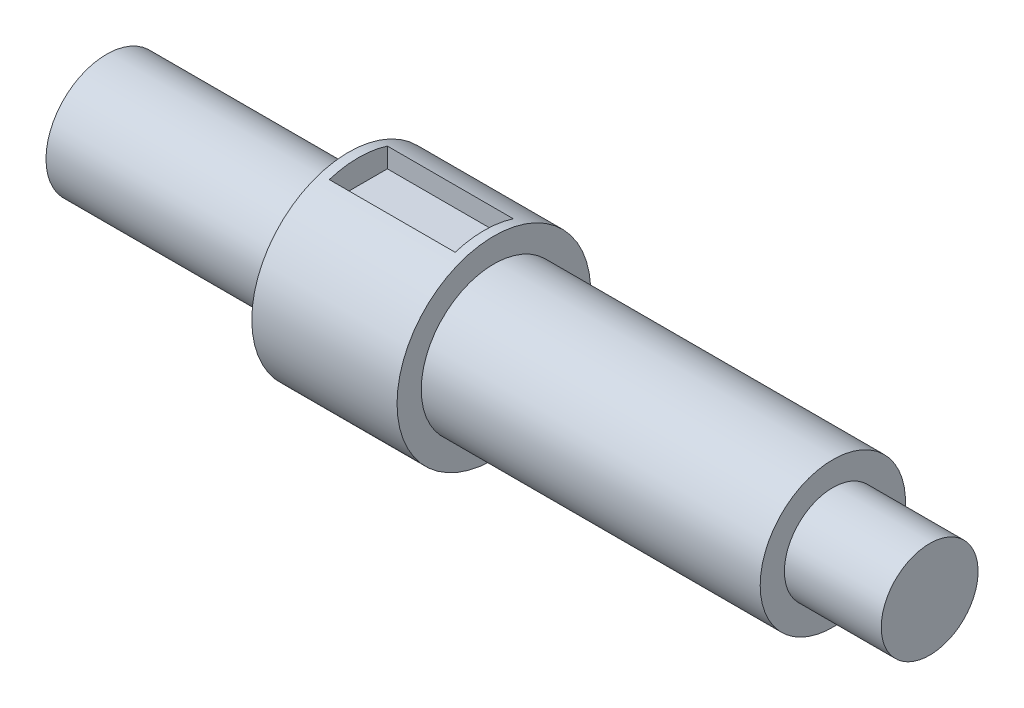
ISO-10303-21;
HEADER;
FILE_DESCRIPTION(('STEP AP214'),'2;1');
FILE_NAME('part.step','',(''),(''),'','','');
FILE_SCHEMA(('AUTOMOTIVE_DESIGN { 1 0 10303 214 1 1 1 1 }'));
ENDSEC;
DATA;
#1=APPLICATION_CONTEXT('core data for automotive mechanical design processes');
#2=APPLICATION_PROTOCOL_DEFINITION('international standard','automotive_design',2000,#1);
#3=PRODUCT_CONTEXT('',#1,'mechanical');
#4=PRODUCT('Part','Part','',(#3));
#5=PRODUCT_RELATED_PRODUCT_CATEGORY('part','',(#4));
#6=PRODUCT_DEFINITION_FORMATION('','',#4);
#7=PRODUCT_DEFINITION_CONTEXT('part definition',#1,'design');
#8=PRODUCT_DEFINITION('design','',#6,#7);
#9=PRODUCT_DEFINITION_SHAPE('','',#8);
#10=(LENGTH_UNIT() NAMED_UNIT(*) SI_UNIT(.MILLI.,.METRE.));
#11=(NAMED_UNIT(*) PLANE_ANGLE_UNIT() SI_UNIT($,.RADIAN.));
#12=(NAMED_UNIT(*) SI_UNIT($,.STERADIAN.) SOLID_ANGLE_UNIT());
#13=UNCERTAINTY_MEASURE_WITH_UNIT(LENGTH_MEASURE(1.E-05),#10,'distance_accuracy_value','');
#14=(GEOMETRIC_REPRESENTATION_CONTEXT(3) GLOBAL_UNCERTAINTY_ASSIGNED_CONTEXT((#13)) GLOBAL_UNIT_ASSIGNED_CONTEXT((#10,
#11,#12)) REPRESENTATION_CONTEXT('',''));
#15=CARTESIAN_POINT('',(0.,0.,0.));
#16=DIRECTION('',(0.,0.,1.));
#17=DIRECTION('',(1.,0.,0.));
#18=AXIS2_PLACEMENT_3D('',#15,#16,#17);
#19=CARTESIAN_POINT('',(0.,12.5,0.));
#20=DIRECTION('',(1.,0.,0.));
#21=DIRECTION('',(0.,0.,-1.));
#22=AXIS2_PLACEMENT_3D('',#19,#20,#21);
#23=PLANE('',#22);
#24=CARTESIAN_POINT('',(0.,0.,0.));
#25=DIRECTION('',(-1.,0.,0.));
#26=DIRECTION('',(0.,0.,1.));
#27=AXIS2_PLACEMENT_3D('',#24,#25,#26);
#28=CIRCLE('',#27,12.5);
#29=CARTESIAN_POINT('',(0.,0.,12.5));
#30=VERTEX_POINT('',#29);
#31=EDGE_CURVE('E109',#30,#30,#28,.T.);
#32=ORIENTED_EDGE('',*,*,#31,.T.);
#33=EDGE_LOOP('',(#32));
#34=FACE_BOUND('',#33,.T.);
#35=ADVANCED_FACE('F41',(#34),#23,.F.);
#36=CARTESIAN_POINT('',(170.,0.,0.));
#37=DIRECTION('',(-1.,0.,0.));
#38=DIRECTION('',(0.,0.,1.));
#39=AXIS2_PLACEMENT_3D('',#36,#37,#38);
#40=PLANE('',#39);
#41=CARTESIAN_POINT('',(170.,0.,0.));
#42=DIRECTION('',(-1.,0.,0.));
#43=DIRECTION('',(0.,0.,1.));
#44=AXIS2_PLACEMENT_3D('',#41,#42,#43);
#45=CIRCLE('',#44,10.);
#46=CARTESIAN_POINT('',(170.,0.,10.));
#47=VERTEX_POINT('',#46);
#48=EDGE_CURVE('E131',#47,#47,#45,.T.);
#49=ORIENTED_EDGE('',*,*,#48,.F.);
#50=EDGE_LOOP('',(#49));
#51=FACE_BOUND('',#50,.T.);
#52=ADVANCED_FACE('F151',(#51),#40,.F.);
#53=CARTESIAN_POINT('',(-10.,0.,0.));
#54=DIRECTION('',(-1.,0.,0.));
#55=DIRECTION('',(0.,0.,1.));
#56=AXIS2_PLACEMENT_3D('',#53,#54,#55);
#57=CYLINDRICAL_SURFACE('',#56,10.);
#58=CARTESIAN_POINT('',(150.,0.,0.));
#59=DIRECTION('',(-1.,0.,0.));
#60=DIRECTION('',(0.,0.,1.));
#61=AXIS2_PLACEMENT_3D('',#58,#59,#60);
#62=CIRCLE('',#61,10.);
#63=CARTESIAN_POINT('',(150.,0.,10.));
#64=VERTEX_POINT('',#63);
#65=EDGE_CURVE('E128',#64,#64,#62,.T.);
#66=ORIENTED_EDGE('',*,*,#65,.F.);
#67=EDGE_LOOP('',(#66));
#68=FACE_BOUND('',#67,.T.);
#69=ORIENTED_EDGE('',*,*,#48,.T.);
#70=EDGE_LOOP('',(#69));
#71=FACE_BOUND('',#70,.T.);
#72=ADVANCED_FACE('F156',(#68,#71),#57,.T.);
#73=CARTESIAN_POINT('',(150.,10.,0.));
#74=DIRECTION('',(-1.,0.,0.));
#75=DIRECTION('',(0.,0.,1.));
#76=AXIS2_PLACEMENT_3D('',#73,#74,#75);
#77=PLANE('',#76);
#78=CARTESIAN_POINT('',(150.,0.,0.));
#79=DIRECTION('',(-1.,0.,0.));
#80=DIRECTION('',(0.,0.,1.));
#81=AXIS2_PLACEMENT_3D('',#78,#79,#80);
#82=CIRCLE('',#81,15.);
#83=CARTESIAN_POINT('',(150.,0.,15.));
#84=VERTEX_POINT('',#83);
#85=EDGE_CURVE('E125',#84,#84,#82,.T.);
#86=ORIENTED_EDGE('',*,*,#85,.F.);
#87=EDGE_LOOP('',(#86));
#88=FACE_BOUND('',#87,.T.);
#89=ORIENTED_EDGE('',*,*,#65,.T.);
#90=EDGE_LOOP('',(#89));
#91=FACE_BOUND('',#90,.T.);
#92=ADVANCED_FACE('F185',(#88,#91),#77,.F.);
#93=CARTESIAN_POINT('',(-10.,0.,0.));
#94=DIRECTION('',(-1.,0.,0.));
#95=DIRECTION('',(0.,0.,1.));
#96=AXIS2_PLACEMENT_3D('',#93,#94,#95);
#97=CYLINDRICAL_SURFACE('',#96,15.);
#98=CARTESIAN_POINT('',(80.,0.,0.));
#99=DIRECTION('',(-1.,0.,0.));
#100=DIRECTION('',(0.,0.,1.));
#101=AXIS2_PLACEMENT_3D('',#98,#99,#100);
#102=CIRCLE('',#101,15.);
#103=CARTESIAN_POINT('',(80.,0.,15.));
#104=VERTEX_POINT('',#103);
#105=EDGE_CURVE('E122',#104,#104,#102,.T.);
#106=ORIENTED_EDGE('',*,*,#105,.F.);
#107=EDGE_LOOP('',(#106));
#108=FACE_BOUND('',#107,.T.);
#109=ORIENTED_EDGE('',*,*,#85,.T.);
#110=EDGE_LOOP('',(#109));
#111=FACE_BOUND('',#110,.T.);
#112=ADVANCED_FACE('F179',(#108,#111),#97,.T.);
#113=CARTESIAN_POINT('',(80.,15.,0.));
#114=DIRECTION('',(-1.,0.,0.));
#115=DIRECTION('',(0.,0.,1.));
#116=AXIS2_PLACEMENT_3D('',#113,#114,#115);
#117=PLANE('',#116);
#118=CARTESIAN_POINT('',(80.,0.,0.));
#119=DIRECTION('',(-1.,0.,0.));
#120=DIRECTION('',(0.,0.,1.));
#121=AXIS2_PLACEMENT_3D('',#118,#119,#120);
#122=CIRCLE('',#121,20.);
#123=CARTESIAN_POINT('',(80.,0.,20.));
#124=VERTEX_POINT('',#123);
#125=EDGE_CURVE('E119',#124,#124,#122,.T.);
#126=ORIENTED_EDGE('',*,*,#125,.F.);
#127=EDGE_LOOP('',(#126));
#128=FACE_BOUND('',#127,.T.);
#129=ORIENTED_EDGE('',*,*,#105,.T.);
#130=EDGE_LOOP('',(#129));
#131=FACE_BOUND('',#130,.T.);
#132=ADVANCED_FACE('F173',(#128,#131),#117,.F.);
#133=CARTESIAN_POINT('',(-10.,0.,0.));
#134=DIRECTION('',(-1.,0.,0.));
#135=DIRECTION('',(0.,0.,1.));
#136=AXIS2_PLACEMENT_3D('',#133,#134,#135);
#137=CYLINDRICAL_SURFACE('',#136,20.);
#138=CARTESIAN_POINT('',(52.,0.,0.));
#139=DIRECTION('',(-1.,0.,0.));
#140=DIRECTION('',(0.,0.,1.));
#141=AXIS2_PLACEMENT_3D('',#138,#139,#140);
#142=CIRCLE('',#141,20.);
#143=CARTESIAN_POINT('',(52.,19.0787840283389,6.));
#144=VERTEX_POINT('',#143);
#145=CARTESIAN_POINT('',(52.,19.0787840283389,-6.));
#146=VERTEX_POINT('',#145);
#147=EDGE_CURVE('E48',#144,#146,#142,.T.);
#148=ORIENTED_EDGE('',*,*,#147,.T.);
#149=DIRECTION('',(-1.,0.,0.));
#150=VECTOR('',#149,1.);
#151=CARTESIAN_POINT('',(-10.,19.0787840283389,-6.));
#152=LINE('',#151,#150);
#153=CARTESIAN_POINT('',(78.,19.0787840283389,-6.));
#154=VERTEX_POINT('',#153);
#155=EDGE_CURVE('E11',#146,#154,#152,.F.);
#156=ORIENTED_EDGE('',*,*,#155,.T.);
#157=CARTESIAN_POINT('',(78.,0.,0.));
#158=DIRECTION('',(1.,0.,0.));
#159=DIRECTION('',(0.,0.,-1.));
#160=AXIS2_PLACEMENT_3D('',#157,#158,#159);
#161=CIRCLE('',#160,20.);
#162=CARTESIAN_POINT('',(78.,19.0787840283389,6.));
#163=VERTEX_POINT('',#162);
#164=EDGE_CURVE('E63',#154,#163,#161,.T.);
#165=ORIENTED_EDGE('',*,*,#164,.T.);
#166=DIRECTION('',(-1.,0.,0.));
#167=VECTOR('',#166,1.);
#168=CARTESIAN_POINT('',(-10.,19.0787840283389,6.));
#169=LINE('',#168,#167);
#170=EDGE_CURVE('E134',#144,#163,#169,.F.);
#171=ORIENTED_EDGE('',*,*,#170,.F.);
#172=EDGE_LOOP('',(#148,#156,#165,#171));
#173=FACE_BOUND('',#172,.T.);
#174=CARTESIAN_POINT('',(50.,0.,0.));
#175=DIRECTION('',(-1.,0.,0.));
#176=DIRECTION('',(0.,0.,1.));
#177=AXIS2_PLACEMENT_3D('',#174,#175,#176);
#178=CIRCLE('',#177,20.);
#179=CARTESIAN_POINT('',(50.,0.,20.));
#180=VERTEX_POINT('',#179);
#181=EDGE_CURVE('E116',#180,#180,#178,.T.);
#182=ORIENTED_EDGE('',*,*,#181,.F.);
#183=EDGE_LOOP('',(#182));
#184=FACE_BOUND('',#183,.T.);
#185=ORIENTED_EDGE('',*,*,#125,.T.);
#186=EDGE_LOOP('',(#185));
#187=FACE_BOUND('',#186,.T.);
#188=ADVANCED_FACE('F137',(#173,#184,#187),#137,.T.);
#189=CARTESIAN_POINT('',(50.,20.,0.));
#190=DIRECTION('',(1.,0.,0.));
#191=DIRECTION('',(0.,0.,-1.));
#192=AXIS2_PLACEMENT_3D('',#189,#190,#191);
#193=PLANE('',#192);
#194=CARTESIAN_POINT('',(50.,0.,0.));
#195=DIRECTION('',(-1.,0.,0.));
#196=DIRECTION('',(0.,0.,1.));
#197=AXIS2_PLACEMENT_3D('',#194,#195,#196);
#198=CIRCLE('',#197,12.5);
#199=CARTESIAN_POINT('',(50.,0.,12.5));
#200=VERTEX_POINT('',#199);
#201=EDGE_CURVE('E113',#200,#200,#198,.T.);
#202=ORIENTED_EDGE('',*,*,#201,.F.);
#203=EDGE_LOOP('',(#202));
#204=FACE_BOUND('',#203,.T.);
#205=ORIENTED_EDGE('',*,*,#181,.T.);
#206=EDGE_LOOP('',(#205));
#207=FACE_BOUND('',#206,.T.);
#208=ADVANCED_FACE('F163',(#204,#207),#193,.F.);
#209=CARTESIAN_POINT('',(-10.,0.,0.));
#210=DIRECTION('',(-1.,0.,0.));
#211=DIRECTION('',(0.,0.,1.));
#212=AXIS2_PLACEMENT_3D('',#209,#210,#211);
#213=CYLINDRICAL_SURFACE('',#212,12.5);
#214=ORIENTED_EDGE('',*,*,#31,.F.);
#215=EDGE_LOOP('',(#214));
#216=FACE_BOUND('',#215,.T.);
#217=ORIENTED_EDGE('',*,*,#201,.T.);
#218=EDGE_LOOP('',(#217));
#219=FACE_BOUND('',#218,.T.);
#220=ADVANCED_FACE('F160',(#216,#219),#213,.T.);
#221=CARTESIAN_POINT('',(52.,15.,-6.));
#222=DIRECTION('',(-1.,0.,0.));
#223=DIRECTION('',(0.,0.,1.));
#224=AXIS2_PLACEMENT_3D('',#221,#222,#223);
#225=PLANE('',#224);
#226=DIRECTION('',(0.,-1.,0.));
#227=VECTOR('',#226,1.);
#228=CARTESIAN_POINT('',(52.,15.,6.));
#229=LINE('',#228,#227);
#230=CARTESIAN_POINT('',(52.,15.,6.));
#231=VERTEX_POINT('',#230);
#232=EDGE_CURVE('E55',#144,#231,#229,.T.);
#233=ORIENTED_EDGE('',*,*,#232,.T.);
#234=DIRECTION('',(0.,0.,1.));
#235=VECTOR('',#234,1.);
#236=CARTESIAN_POINT('',(52.,15.,-6.));
#237=LINE('',#236,#235);
#238=CARTESIAN_POINT('',(52.,15.,-6.));
#239=VERTEX_POINT('',#238);
#240=EDGE_CURVE('E85',#239,#231,#237,.T.);
#241=ORIENTED_EDGE('',*,*,#240,.F.);
#242=DIRECTION('',(0.,-1.,0.));
#243=VECTOR('',#242,1.);
#244=CARTESIAN_POINT('',(52.,15.,-6.));
#245=LINE('',#244,#243);
#246=EDGE_CURVE('E103',#146,#239,#245,.T.);
#247=ORIENTED_EDGE('',*,*,#246,.F.);
#248=ORIENTED_EDGE('',*,*,#147,.F.);
#249=EDGE_LOOP('',(#233,#241,#247,#248));
#250=FACE_BOUND('',#249,.T.);
#251=ADVANCED_FACE('F83',(#250),#225,.F.);
#252=CARTESIAN_POINT('',(78.,15.,-6.));
#253=DIRECTION('',(1.,0.,0.));
#254=DIRECTION('',(0.,0.,-1.));
#255=AXIS2_PLACEMENT_3D('',#252,#253,#254);
#256=PLANE('',#255);
#257=DIRECTION('',(0.,1.,0.));
#258=VECTOR('',#257,1.);
#259=CARTESIAN_POINT('',(78.,15.,-6.));
#260=LINE('',#259,#258);
#261=CARTESIAN_POINT('',(78.,15.,-6.));
#262=VERTEX_POINT('',#261);
#263=EDGE_CURVE('E98',#262,#154,#260,.T.);
#264=ORIENTED_EDGE('',*,*,#263,.F.);
#265=DIRECTION('',(0.,0.,1.));
#266=VECTOR('',#265,1.);
#267=CARTESIAN_POINT('',(78.,15.,-6.));
#268=LINE('',#267,#266);
#269=CARTESIAN_POINT('',(78.,15.,6.));
#270=VERTEX_POINT('',#269);
#271=EDGE_CURVE('E97',#262,#270,#268,.T.);
#272=ORIENTED_EDGE('',*,*,#271,.T.);
#273=DIRECTION('',(0.,1.,0.));
#274=VECTOR('',#273,1.);
#275=CARTESIAN_POINT('',(78.,15.,6.));
#276=LINE('',#275,#274);
#277=EDGE_CURVE('E101',#270,#163,#276,.T.);
#278=ORIENTED_EDGE('',*,*,#277,.T.);
#279=ORIENTED_EDGE('',*,*,#164,.F.);
#280=EDGE_LOOP('',(#264,#272,#278,#279));
#281=FACE_BOUND('',#280,.T.);
#282=ADVANCED_FACE('F139',(#281),#256,.F.);
#283=CARTESIAN_POINT('',(0.,0.,-6.));
#284=DIRECTION('',(0.,0.,-1.));
#285=DIRECTION('',(-1.,0.,0.));
#286=AXIS2_PLACEMENT_3D('',#283,#284,#285);
#287=PLANE('',#286);
#288=ORIENTED_EDGE('',*,*,#246,.T.);
#289=DIRECTION('',(1.,0.,0.));
#290=VECTOR('',#289,1.);
#291=CARTESIAN_POINT('',(52.,15.,-6.));
#292=LINE('',#291,#290);
#293=EDGE_CURVE('E96',#239,#262,#292,.T.);
#294=ORIENTED_EDGE('',*,*,#293,.T.);
#295=ORIENTED_EDGE('',*,*,#263,.T.);
#296=ORIENTED_EDGE('',*,*,#155,.F.);
#297=EDGE_LOOP('',(#288,#294,#295,#296));
#298=FACE_BOUND('',#297,.T.);
#299=ADVANCED_FACE('F141',(#298),#287,.F.);
#300=CARTESIAN_POINT('',(0.,0.,6.));
#301=DIRECTION('',(0.,0.,-1.));
#302=DIRECTION('',(-1.,0.,0.));
#303=AXIS2_PLACEMENT_3D('',#300,#301,#302);
#304=PLANE('',#303);
#305=ORIENTED_EDGE('',*,*,#170,.T.);
#306=ORIENTED_EDGE('',*,*,#277,.F.);
#307=DIRECTION('',(1.,0.,0.));
#308=VECTOR('',#307,1.);
#309=CARTESIAN_POINT('',(52.,15.,6.));
#310=LINE('',#309,#308);
#311=EDGE_CURVE('E89',#231,#270,#310,.T.);
#312=ORIENTED_EDGE('',*,*,#311,.F.);
#313=ORIENTED_EDGE('',*,*,#232,.F.);
#314=EDGE_LOOP('',(#305,#306,#312,#313));
#315=FACE_BOUND('',#314,.T.);
#316=ADVANCED_FACE('F100',(#315),#304,.T.);
#317=CARTESIAN_POINT('',(52.,15.,-6.));
#318=DIRECTION('',(0.,-1.,0.));
#319=DIRECTION('',(0.,0.,-1.));
#320=AXIS2_PLACEMENT_3D('',#317,#318,#319);
#321=PLANE('',#320);
#322=ORIENTED_EDGE('',*,*,#271,.F.);
#323=ORIENTED_EDGE('',*,*,#293,.F.);
#324=ORIENTED_EDGE('',*,*,#240,.T.);
#325=ORIENTED_EDGE('',*,*,#311,.T.);
#326=EDGE_LOOP('',(#322,#323,#324,#325));
#327=FACE_BOUND('',#326,.T.);
#328=ADVANCED_FACE('F93',(#327),#321,.F.);
#329=CLOSED_SHELL('',(#35,#52,#72,#92,#112,#132,#188,#208,#220,#251,#282,#299,#316,#328));
#330=MANIFOLD_SOLID_BREP('B2',#329);
#331=ADVANCED_BREP_SHAPE_REPRESENTATION('',(#18,#330),#14);
#332=SHAPE_DEFINITION_REPRESENTATION(#9,#331);
ENDSEC;
END-ISO-10303-21;
